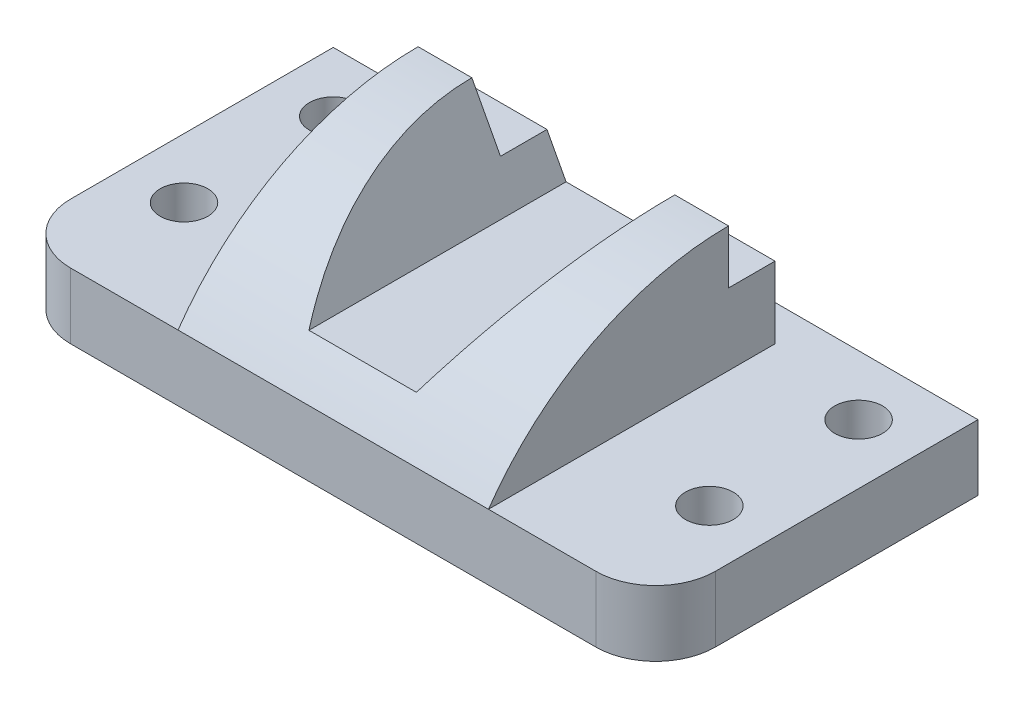
ISO-10303-21;
HEADER;
FILE_DESCRIPTION(('STEP AP214'),'2;1');
FILE_NAME('part.step','',(''),(''),'','','');
FILE_SCHEMA(('AUTOMOTIVE_DESIGN { 1 0 10303 214 1 1 1 1 }'));
ENDSEC;
DATA;
#1=APPLICATION_CONTEXT('core data for automotive mechanical design processes');
#2=APPLICATION_PROTOCOL_DEFINITION('international standard','automotive_design',2000,#1);
#3=PRODUCT_CONTEXT('',#1,'mechanical');
#4=PRODUCT('Part','Part','',(#3));
#5=PRODUCT_RELATED_PRODUCT_CATEGORY('part','',(#4));
#6=PRODUCT_DEFINITION_FORMATION('','',#4);
#7=PRODUCT_DEFINITION_CONTEXT('part definition',#1,'design');
#8=PRODUCT_DEFINITION('design','',#6,#7);
#9=PRODUCT_DEFINITION_SHAPE('','',#8);
#10=(LENGTH_UNIT() NAMED_UNIT(*) SI_UNIT(.MILLI.,.METRE.));
#11=(NAMED_UNIT(*) PLANE_ANGLE_UNIT() SI_UNIT($,.RADIAN.));
#12=(NAMED_UNIT(*) SI_UNIT($,.STERADIAN.) SOLID_ANGLE_UNIT());
#13=UNCERTAINTY_MEASURE_WITH_UNIT(LENGTH_MEASURE(1.E-05),#10,'distance_accuracy_value','');
#14=(GEOMETRIC_REPRESENTATION_CONTEXT(3) GLOBAL_UNCERTAINTY_ASSIGNED_CONTEXT((#13)) GLOBAL_UNIT_ASSIGNED_CONTEXT((#10,
#11,#12)) REPRESENTATION_CONTEXT('',''));
#15=CARTESIAN_POINT('',(0.,0.,0.));
#16=DIRECTION('',(0.,0.,1.));
#17=DIRECTION('',(1.,0.,0.));
#18=AXIS2_PLACEMENT_3D('',#15,#16,#17);
#19=CARTESIAN_POINT('',(26.,0.,27.));
#20=DIRECTION('',(-1.,0.,0.));
#21=DIRECTION('',(0.,0.,1.));
#22=AXIS2_PLACEMENT_3D('',#19,#20,#21);
#23=PLANE('',#22);
#24=DIRECTION('',(0.,-1.,0.));
#25=VECTOR('',#24,1.);
#26=CARTESIAN_POINT('',(26.,0.,-21.));
#27=LINE('',#26,#25);
#28=CARTESIAN_POINT('',(26.,23.,-21.));
#29=VERTEX_POINT('',#28);
#30=CARTESIAN_POINT('',(26.,10.9999999999999,-21.));
#31=VERTEX_POINT('',#30);
#32=EDGE_CURVE('E405',#29,#31,#27,.T.);
#33=ORIENTED_EDGE('',*,*,#32,.F.);
#34=DIRECTION('',(0.,0.,-1.));
#35=VECTOR('',#34,1.);
#36=CARTESIAN_POINT('',(26.,23.,27.));
#37=LINE('',#36,#35);
#38=CARTESIAN_POINT('',(26.,23.,-13.2119385257662));
#39=VERTEX_POINT('',#38);
#40=EDGE_CURVE('E391',#39,#29,#37,.T.);
#41=ORIENTED_EDGE('',*,*,#40,.F.);
#42=DIRECTION('',(0.,-1.,0.));
#43=VECTOR('',#42,1.);
#44=CARTESIAN_POINT('',(26.,0.,-13.2119385257662));
#45=LINE('',#44,#43);
#46=CARTESIAN_POINT('',(26.,32.,-13.2119385257662));
#47=VERTEX_POINT('',#46);
#48=EDGE_CURVE('E384',#47,#39,#45,.T.);
#49=ORIENTED_EDGE('',*,*,#48,.F.);
#50=CARTESIAN_POINT('',(26.,-17.,-13.2119385257662));
#51=DIRECTION('',(-1.,0.,0.));
#52=DIRECTION('',(0.,0.,1.));
#53=AXIS2_PLACEMENT_3D('',#50,#51,#52);
#54=CIRCLE('',#53,49.);
#55=CARTESIAN_POINT('',(26.,10.9999999999999,27.));
#56=VERTEX_POINT('',#55);
#57=EDGE_CURVE('E192',#56,#47,#54,.T.);
#58=ORIENTED_EDGE('',*,*,#57,.F.);
#59=DIRECTION('',(0.,0.,-1.));
#60=VECTOR('',#59,1.);
#61=CARTESIAN_POINT('',(26.,11.,27.));
#62=LINE('',#61,#60);
#63=EDGE_CURVE('E231',#56,#31,#62,.T.);
#64=ORIENTED_EDGE('',*,*,#63,.T.);
#65=EDGE_LOOP('',(#33,#41,#49,#58,#64));
#66=FACE_BOUND('',#65,.T.);
#67=ADVANCED_FACE('F41',(#66),#23,.F.);
#68=CARTESIAN_POINT('',(-0.0519031141868566,0.0276816608996569,27.));
#69=DIRECTION('',(0.88235294117647,-0.470588235294118,0.));
#70=DIRECTION('',(0.470588235294118,0.882352941176471,0.));
#71=AXIS2_PLACEMENT_3D('',#68,#69,#70);
#72=PLANE('',#71);
#73=DIRECTION('',(0.470588235294118,0.882352941176471,0.));
#74=VECTOR('',#73,1.);
#75=CARTESIAN_POINT('',(-0.0519031141868509,0.0276816608996677,-21.));
#76=LINE('',#75,#74);
#77=CARTESIAN_POINT('',(9.,17.,-21.));
#78=VERTEX_POINT('',#77);
#79=CARTESIAN_POINT('',(12.2,22.9999999999999,-21.));
#80=VERTEX_POINT('',#79);
#81=EDGE_CURVE('E399',#78,#80,#76,.T.);
#82=ORIENTED_EDGE('',*,*,#81,.F.);
#83=DIRECTION('',(0.,0.,-1.));
#84=VECTOR('',#83,1.);
#85=CARTESIAN_POINT('',(9.,17.,27.));
#86=LINE('',#85,#84);
#87=CARTESIAN_POINT('',(8.99999999999999,17.0000000000003,22.0726190029881));
#88=VERTEX_POINT('',#87);
#89=EDGE_CURVE('E230',#88,#78,#86,.T.);
#90=ORIENTED_EDGE('',*,*,#89,.F.);
#91=CARTESIAN_POINT('',(-9.13333333333344,-17.0000000000002,-13.2119385257662));
#92=DIRECTION('',(0.88235294117647,-0.470588235294118,0.));
#93=DIRECTION('',(0.470588235294118,0.882352941176471,0.));
#94=AXIS2_PLACEMENT_3D('',#91,#92,#93);
#95=ELLIPSE('',#94,55.5333333333335,49.);
#96=CARTESIAN_POINT('',(17.,32.,-13.2119385257662));
#97=VERTEX_POINT('',#96);
#98=EDGE_CURVE('E195',#97,#88,#95,.T.);
#99=ORIENTED_EDGE('',*,*,#98,.F.);
#100=DIRECTION('',(0.470588235294118,0.882352941176471,0.));
#101=VECTOR('',#100,1.);
#102=CARTESIAN_POINT('',(-0.0519031141868566,0.0276816608996569,-13.2119385257662));
#103=LINE('',#102,#101);
#104=CARTESIAN_POINT('',(12.1999999999999,22.9999999999999,-13.2119385257662));
#105=VERTEX_POINT('',#104);
#106=EDGE_CURVE('E382',#105,#97,#103,.T.);
#107=ORIENTED_EDGE('',*,*,#106,.F.);
#108=DIRECTION('',(0.,0.,1.));
#109=VECTOR('',#108,1.);
#110=CARTESIAN_POINT('',(12.2,22.9999999999999,27.));
#111=LINE('',#110,#109);
#112=EDGE_CURVE('E388',#80,#105,#111,.T.);
#113=ORIENTED_EDGE('',*,*,#112,.F.);
#114=EDGE_LOOP('',(#82,#90,#99,#107,#113));
#115=FACE_BOUND('',#114,.T.);
#116=ADVANCED_FACE('F278',(#115),#72,.F.);
#117=CARTESIAN_POINT('',(0.,17.,27.));
#118=DIRECTION('',(0.,1.,0.));
#119=DIRECTION('',(0.,0.,1.));
#120=AXIS2_PLACEMENT_3D('',#117,#118,#119);
#121=PLANE('',#120);
#122=ORIENTED_EDGE('',*,*,#89,.T.);
#123=DIRECTION('',(-1.,0.,0.));
#124=VECTOR('',#123,1.);
#125=CARTESIAN_POINT('',(0.,17.,-21.));
#126=LINE('',#125,#124);
#127=CARTESIAN_POINT('',(-9.,17.,-21.));
#128=VERTEX_POINT('',#127);
#129=EDGE_CURVE('E400',#78,#128,#126,.T.);
#130=ORIENTED_EDGE('',*,*,#129,.T.);
#131=DIRECTION('',(0.,0.,-1.));
#132=VECTOR('',#131,1.);
#133=CARTESIAN_POINT('',(-9.,17.,27.));
#134=LINE('',#133,#132);
#135=CARTESIAN_POINT('',(-9.,17.,22.0726190029884));
#136=VERTEX_POINT('',#135);
#137=EDGE_CURVE('E223',#136,#128,#134,.T.);
#138=ORIENTED_EDGE('',*,*,#137,.F.);
#139=DIRECTION('',(1.,0.,0.));
#140=VECTOR('',#139,1.);
#141=CARTESIAN_POINT('',(-54.,17.,22.0726190029881));
#142=LINE('',#141,#140);
#143=EDGE_CURVE('E189',#136,#88,#142,.T.);
#144=ORIENTED_EDGE('',*,*,#143,.T.);
#145=EDGE_LOOP('',(#122,#130,#138,#144));
#146=FACE_BOUND('',#145,.T.);
#147=ADVANCED_FACE('F286',(#146),#121,.T.);
#148=CARTESIAN_POINT('',(0.0519031141868566,0.0276816608996569,27.));
#149=DIRECTION('',(0.88235294117647,0.470588235294118,0.));
#150=DIRECTION('',(-0.470588235294118,0.882352941176471,0.));
#151=AXIS2_PLACEMENT_3D('',#148,#149,#150);
#152=PLANE('',#151);
#153=ORIENTED_EDGE('',*,*,#137,.T.);
#154=DIRECTION('',(-0.470588235294118,0.882352941176471,0.));
#155=VECTOR('',#154,1.);
#156=CARTESIAN_POINT('',(0.0519031141868509,0.0276816608996677,-21.));
#157=LINE('',#156,#155);
#158=CARTESIAN_POINT('',(-12.1999999999999,22.9999999999998,-21.));
#159=VERTEX_POINT('',#158);
#160=EDGE_CURVE('E393',#128,#159,#157,.T.);
#161=ORIENTED_EDGE('',*,*,#160,.T.);
#162=DIRECTION('',(0.,0.,1.));
#163=VECTOR('',#162,1.);
#164=CARTESIAN_POINT('',(-12.1999999999999,22.9999999999998,27.));
#165=LINE('',#164,#163);
#166=CARTESIAN_POINT('',(-12.1999999999999,22.9999999999998,-13.2119385257662));
#167=VERTEX_POINT('',#166);
#168=EDGE_CURVE('E390',#159,#167,#165,.T.);
#169=ORIENTED_EDGE('',*,*,#168,.T.);
#170=DIRECTION('',(-0.470588235294118,0.882352941176471,0.));
#171=VECTOR('',#170,1.);
#172=CARTESIAN_POINT('',(0.0519031141868566,0.0276816608996569,-13.2119385257662));
#173=LINE('',#172,#171);
#174=CARTESIAN_POINT('',(-17.,31.9999999999998,-13.2119385257662));
#175=VERTEX_POINT('',#174);
#176=EDGE_CURVE('E167',#167,#175,#173,.T.);
#177=ORIENTED_EDGE('',*,*,#176,.T.);
#178=CARTESIAN_POINT('',(9.13333333333338,-17.0000000000001,-13.2119385257662));
#179=DIRECTION('',(0.88235294117647,0.470588235294118,0.));
#180=DIRECTION('',(0.470588235294118,-0.882352941176471,0.));
#181=AXIS2_PLACEMENT_3D('',#178,#179,#180);
#182=ELLIPSE('',#181,55.5333333333332,49.);
#183=EDGE_CURVE('E180',#175,#136,#182,.T.);
#184=ORIENTED_EDGE('',*,*,#183,.T.);
#185=EDGE_LOOP('',(#153,#161,#169,#177,#184));
#186=FACE_BOUND('',#185,.T.);
#187=ADVANCED_FACE('F291',(#186),#152,.T.);
#188=CARTESIAN_POINT('',(-26.,0.,27.));
#189=DIRECTION('',(-1.,0.,0.));
#190=DIRECTION('',(0.,0.,1.));
#191=AXIS2_PLACEMENT_3D('',#188,#189,#190);
#192=PLANE('',#191);
#193=DIRECTION('',(0.,0.,-1.));
#194=VECTOR('',#193,1.);
#195=CARTESIAN_POINT('',(-26.,22.9999999999998,27.));
#196=LINE('',#195,#194);
#197=CARTESIAN_POINT('',(-26.,22.9999999999996,-13.2119385257662));
#198=VERTEX_POINT('',#197);
#199=CARTESIAN_POINT('',(-26.,22.9999999999998,-21.));
#200=VERTEX_POINT('',#199);
#201=EDGE_CURVE('E234',#198,#200,#196,.T.);
#202=ORIENTED_EDGE('',*,*,#201,.T.);
#203=DIRECTION('',(0.,-1.,0.));
#204=VECTOR('',#203,1.);
#205=CARTESIAN_POINT('',(-26.,0.,-21.));
#206=LINE('',#205,#204);
#207=CARTESIAN_POINT('',(-26.,10.9999999999996,-21.));
#208=VERTEX_POINT('',#207);
#209=EDGE_CURVE('E240',#200,#208,#206,.T.);
#210=ORIENTED_EDGE('',*,*,#209,.T.);
#211=DIRECTION('',(0.,0.,-1.));
#212=VECTOR('',#211,1.);
#213=CARTESIAN_POINT('',(-26.,11.,27.));
#214=LINE('',#213,#212);
#215=CARTESIAN_POINT('',(-26.,10.9999999999996,27.));
#216=VERTEX_POINT('',#215);
#217=EDGE_CURVE('E184',#216,#208,#214,.T.);
#218=ORIENTED_EDGE('',*,*,#217,.F.);
#219=CARTESIAN_POINT('',(-26.,-17.0000000000003,-13.2119385257662));
#220=DIRECTION('',(-1.,0.,0.));
#221=DIRECTION('',(0.,0.,1.));
#222=AXIS2_PLACEMENT_3D('',#219,#220,#221);
#223=CIRCLE('',#222,49.);
#224=CARTESIAN_POINT('',(-26.,31.9999999999997,-13.2119385257662));
#225=VERTEX_POINT('',#224);
#226=EDGE_CURVE('E173',#216,#225,#223,.T.);
#227=ORIENTED_EDGE('',*,*,#226,.T.);
#228=DIRECTION('',(0.,-1.,0.));
#229=VECTOR('',#228,1.);
#230=CARTESIAN_POINT('',(-26.,0.,-13.2119385257662));
#231=LINE('',#230,#229);
#232=EDGE_CURVE('E154',#225,#198,#231,.T.);
#233=ORIENTED_EDGE('',*,*,#232,.T.);
#234=EDGE_LOOP('',(#202,#210,#218,#227,#233));
#235=FACE_BOUND('',#234,.T.);
#236=ADVANCED_FACE('F182',(#235),#192,.T.);
#237=CARTESIAN_POINT('',(0.,11.,27.));
#238=DIRECTION('',(0.,1.,0.));
#239=DIRECTION('',(0.,0.,1.));
#240=AXIS2_PLACEMENT_3D('',#237,#238,#239);
#241=PLANE('',#240);
#242=CARTESIAN_POINT('',(44.,11.,-17.));
#243=DIRECTION('',(0.,1.,0.));
#244=DIRECTION('',(0.,0.,-1.));
#245=AXIS2_PLACEMENT_3D('',#242,#243,#244);
#246=CIRCLE('',#245,4.00000000000001);
#247=CARTESIAN_POINT('',(44.,11.,-21.));
#248=VERTEX_POINT('',#247);
#249=EDGE_CURVE('E364',#248,#248,#246,.T.);
#250=ORIENTED_EDGE('',*,*,#249,.F.);
#251=EDGE_LOOP('',(#250));
#252=FACE_BOUND('',#251,.T.);
#253=CARTESIAN_POINT('',(44.,11.,8.));
#254=DIRECTION('',(0.,1.,0.));
#255=DIRECTION('',(0.,0.,-1.));
#256=AXIS2_PLACEMENT_3D('',#253,#254,#255);
#257=CIRCLE('',#256,4.00000000000001);
#258=CARTESIAN_POINT('',(44.,11.,4.));
#259=VERTEX_POINT('',#258);
#260=EDGE_CURVE('E360',#259,#259,#257,.T.);
#261=ORIENTED_EDGE('',*,*,#260,.F.);
#262=EDGE_LOOP('',(#261));
#263=FACE_BOUND('',#262,.T.);
#264=CARTESIAN_POINT('',(-44.,11.,8.));
#265=DIRECTION('',(0.,1.,0.));
#266=DIRECTION('',(0.,0.,1.));
#267=AXIS2_PLACEMENT_3D('',#264,#265,#266);
#268=CIRCLE('',#267,4.00000000000001);
#269=CARTESIAN_POINT('',(-44.,11.,12.));
#270=VERTEX_POINT('',#269);
#271=EDGE_CURVE('E348',#270,#270,#268,.T.);
#272=ORIENTED_EDGE('',*,*,#271,.F.);
#273=EDGE_LOOP('',(#272));
#274=FACE_BOUND('',#273,.T.);
#275=CARTESIAN_POINT('',(-44.,11.,-17.));
#276=DIRECTION('',(0.,1.,0.));
#277=DIRECTION('',(0.,0.,1.));
#278=AXIS2_PLACEMENT_3D('',#275,#276,#277);
#279=CIRCLE('',#278,4.00000000000001);
#280=CARTESIAN_POINT('',(-44.,11.,-13.));
#281=VERTEX_POINT('',#280);
#282=EDGE_CURVE('E351',#281,#281,#279,.T.);
#283=ORIENTED_EDGE('',*,*,#282,.F.);
#284=EDGE_LOOP('',(#283));
#285=FACE_BOUND('',#284,.T.);
#286=DIRECTION('',(1.,0.,0.));
#287=VECTOR('',#286,1.);
#288=CARTESIAN_POINT('',(0.,11.,27.));
#289=LINE('',#288,#287);
#290=CARTESIAN_POINT('',(44.,11.,27.));
#291=VERTEX_POINT('',#290);
#292=EDGE_CURVE('E197',#56,#291,#289,.T.);
#293=ORIENTED_EDGE('',*,*,#292,.T.);
#294=CARTESIAN_POINT('',(44.,11.,17.));
#295=DIRECTION('',(0.,1.,0.));
#296=DIRECTION('',(0.,0.,1.));
#297=AXIS2_PLACEMENT_3D('',#294,#295,#296);
#298=CIRCLE('',#297,10.);
#299=CARTESIAN_POINT('',(54.,11.,17.));
#300=VERTEX_POINT('',#299);
#301=EDGE_CURVE('E246',#291,#300,#298,.T.);
#302=ORIENTED_EDGE('',*,*,#301,.T.);
#303=DIRECTION('',(0.,0.,-1.));
#304=VECTOR('',#303,1.);
#305=CARTESIAN_POINT('',(54.,11.,27.));
#306=LINE('',#305,#304);
#307=CARTESIAN_POINT('',(54.,11.,-27.));
#308=VERTEX_POINT('',#307);
#309=EDGE_CURVE('E206',#300,#308,#306,.T.);
#310=ORIENTED_EDGE('',*,*,#309,.T.);
#311=DIRECTION('',(1.,0.,0.));
#312=VECTOR('',#311,1.);
#313=CARTESIAN_POINT('',(0.,11.,-27.));
#314=LINE('',#313,#312);
#315=CARTESIAN_POINT('',(-54.,11.,-27.));
#316=VERTEX_POINT('',#315);
#317=EDGE_CURVE('E198',#316,#308,#314,.T.);
#318=ORIENTED_EDGE('',*,*,#317,.F.);
#319=DIRECTION('',(0.,0.,-1.));
#320=VECTOR('',#319,1.);
#321=CARTESIAN_POINT('',(-54.,11.,27.));
#322=LINE('',#321,#320);
#323=CARTESIAN_POINT('',(-54.,11.,17.));
#324=VERTEX_POINT('',#323);
#325=EDGE_CURVE('E225',#324,#316,#322,.T.);
#326=ORIENTED_EDGE('',*,*,#325,.F.);
#327=CARTESIAN_POINT('',(-44.,11.,17.));
#328=DIRECTION('',(0.,1.,0.));
#329=DIRECTION('',(0.,0.,1.));
#330=AXIS2_PLACEMENT_3D('',#327,#328,#329);
#331=CIRCLE('',#330,10.);
#332=CARTESIAN_POINT('',(-44.,11.,27.));
#333=VERTEX_POINT('',#332);
#334=EDGE_CURVE('E243',#324,#333,#331,.T.);
#335=ORIENTED_EDGE('',*,*,#334,.T.);
#336=DIRECTION('',(1.,0.,0.));
#337=VECTOR('',#336,1.);
#338=CARTESIAN_POINT('',(0.,11.,27.));
#339=LINE('',#338,#337);
#340=EDGE_CURVE('E199',#333,#216,#339,.T.);
#341=ORIENTED_EDGE('',*,*,#340,.T.);
#342=ORIENTED_EDGE('',*,*,#217,.T.);
#343=DIRECTION('',(1.,0.,0.));
#344=VECTOR('',#343,1.);
#345=CARTESIAN_POINT('',(-54.0000000000001,10.9999999999995,-21.));
#346=LINE('',#345,#344);
#347=EDGE_CURVE('E170',#208,#31,#346,.T.);
#348=ORIENTED_EDGE('',*,*,#347,.T.);
#349=ORIENTED_EDGE('',*,*,#63,.F.);
#350=EDGE_LOOP('',(#293,#302,#310,#318,#326,#335,#341,#342,#348,#349));
#351=FACE_BOUND('',#350,.T.);
#352=ADVANCED_FACE('F257',(#252,#263,#274,#285,#351),#241,.T.);
#353=CARTESIAN_POINT('',(-54.,2.72509287862538E-13,27.));
#354=DIRECTION('',(-1.,0.,0.));
#355=DIRECTION('',(0.,-1.,0.));
#356=AXIS2_PLACEMENT_3D('',#353,#354,#355);
#357=PLANE('',#356);
#358=DIRECTION('',(0.,0.,-1.));
#359=VECTOR('',#358,1.);
#360=CARTESIAN_POINT('',(-54.,0.,27.));
#361=LINE('',#360,#359);
#362=CARTESIAN_POINT('',(-54.,0.,17.));
#363=VERTEX_POINT('',#362);
#364=CARTESIAN_POINT('',(-54.,0.,-27.));
#365=VERTEX_POINT('',#364);
#366=EDGE_CURVE('E219',#363,#365,#361,.T.);
#367=ORIENTED_EDGE('',*,*,#366,.F.);
#368=DIRECTION('',(0.,1.,0.));
#369=VECTOR('',#368,1.);
#370=CARTESIAN_POINT('',(-54.,2.72509287862538E-13,17.));
#371=LINE('',#370,#369);
#372=EDGE_CURVE('E11',#363,#324,#371,.T.);
#373=ORIENTED_EDGE('',*,*,#372,.T.);
#374=ORIENTED_EDGE('',*,*,#325,.T.);
#375=DIRECTION('',(0.,1.,0.));
#376=VECTOR('',#375,1.);
#377=CARTESIAN_POINT('',(-54.,2.72509287862538E-13,-27.));
#378=LINE('',#377,#376);
#379=EDGE_CURVE('E207',#365,#316,#378,.T.);
#380=ORIENTED_EDGE('',*,*,#379,.F.);
#381=EDGE_LOOP('',(#367,#373,#374,#380));
#382=FACE_BOUND('',#381,.T.);
#383=ADVANCED_FACE('F271',(#382),#357,.T.);
#384=CARTESIAN_POINT('',(0.,0.,27.));
#385=DIRECTION('',(0.,1.,0.));
#386=DIRECTION('',(-1.,0.,0.));
#387=AXIS2_PLACEMENT_3D('',#384,#385,#386);
#388=PLANE('',#387);
#389=CARTESIAN_POINT('',(44.,0.,-17.));
#390=DIRECTION('',(0.,1.,0.));
#391=DIRECTION('',(0.,0.,-1.));
#392=AXIS2_PLACEMENT_3D('',#389,#390,#391);
#393=CIRCLE('',#392,4.00000000000001);
#394=CARTESIAN_POINT('',(44.,0.,-21.));
#395=VERTEX_POINT('',#394);
#396=EDGE_CURVE('E366',#395,#395,#393,.T.);
#397=ORIENTED_EDGE('',*,*,#396,.T.);
#398=EDGE_LOOP('',(#397));
#399=FACE_BOUND('',#398,.T.);
#400=CARTESIAN_POINT('',(44.,0.,8.));
#401=DIRECTION('',(0.,1.,0.));
#402=DIRECTION('',(0.,0.,-1.));
#403=AXIS2_PLACEMENT_3D('',#400,#401,#402);
#404=CIRCLE('',#403,4.00000000000001);
#405=CARTESIAN_POINT('',(44.,0.,4.));
#406=VERTEX_POINT('',#405);
#407=EDGE_CURVE('E362',#406,#406,#404,.T.);
#408=ORIENTED_EDGE('',*,*,#407,.T.);
#409=EDGE_LOOP('',(#408));
#410=FACE_BOUND('',#409,.T.);
#411=CARTESIAN_POINT('',(-44.,0.,8.));
#412=DIRECTION('',(0.,1.,0.));
#413=DIRECTION('',(0.,0.,1.));
#414=AXIS2_PLACEMENT_3D('',#411,#412,#413);
#415=CIRCLE('',#414,4.00000000000001);
#416=CARTESIAN_POINT('',(-44.,0.,12.));
#417=VERTEX_POINT('',#416);
#418=EDGE_CURVE('E350',#417,#417,#415,.T.);
#419=ORIENTED_EDGE('',*,*,#418,.T.);
#420=EDGE_LOOP('',(#419));
#421=FACE_BOUND('',#420,.T.);
#422=CARTESIAN_POINT('',(-44.,0.,-17.));
#423=DIRECTION('',(0.,1.,0.));
#424=DIRECTION('',(0.,0.,1.));
#425=AXIS2_PLACEMENT_3D('',#422,#423,#424);
#426=CIRCLE('',#425,4.00000000000001);
#427=CARTESIAN_POINT('',(-44.,0.,-13.));
#428=VERTEX_POINT('',#427);
#429=EDGE_CURVE('E352',#428,#428,#426,.T.);
#430=ORIENTED_EDGE('',*,*,#429,.T.);
#431=EDGE_LOOP('',(#430));
#432=FACE_BOUND('',#431,.T.);
#433=DIRECTION('',(0.,0.,-1.));
#434=VECTOR('',#433,1.);
#435=CARTESIAN_POINT('',(54.,0.,27.));
#436=LINE('',#435,#434);
#437=CARTESIAN_POINT('',(54.,0.,17.));
#438=VERTEX_POINT('',#437);
#439=CARTESIAN_POINT('',(54.,0.,-27.));
#440=VERTEX_POINT('',#439);
#441=EDGE_CURVE('E217',#438,#440,#436,.T.);
#442=ORIENTED_EDGE('',*,*,#441,.F.);
#443=CARTESIAN_POINT('',(44.,0.,17.));
#444=DIRECTION('',(0.,1.,0.));
#445=DIRECTION('',(-1.,0.,0.));
#446=AXIS2_PLACEMENT_3D('',#443,#444,#445);
#447=CIRCLE('',#446,10.);
#448=CARTESIAN_POINT('',(44.,0.,27.));
#449=VERTEX_POINT('',#448);
#450=EDGE_CURVE('E47',#438,#449,#447,.F.);
#451=ORIENTED_EDGE('',*,*,#450,.T.);
#452=DIRECTION('',(1.,0.,0.));
#453=VECTOR('',#452,1.);
#454=CARTESIAN_POINT('',(0.,0.,27.));
#455=LINE('',#454,#453);
#456=CARTESIAN_POINT('',(-44.,0.,27.));
#457=VERTEX_POINT('',#456);
#458=EDGE_CURVE('E201',#457,#449,#455,.T.);
#459=ORIENTED_EDGE('',*,*,#458,.F.);
#460=CARTESIAN_POINT('',(-44.,0.,17.));
#461=DIRECTION('',(0.,1.,0.));
#462=DIRECTION('',(-1.,0.,0.));
#463=AXIS2_PLACEMENT_3D('',#460,#461,#462);
#464=CIRCLE('',#463,10.);
#465=EDGE_CURVE('E57',#457,#363,#464,.F.);
#466=ORIENTED_EDGE('',*,*,#465,.T.);
#467=ORIENTED_EDGE('',*,*,#366,.T.);
#468=DIRECTION('',(1.,0.,0.));
#469=VECTOR('',#468,1.);
#470=CARTESIAN_POINT('',(0.,0.,-27.));
#471=LINE('',#470,#469);
#472=EDGE_CURVE('E215',#365,#440,#471,.T.);
#473=ORIENTED_EDGE('',*,*,#472,.T.);
#474=EDGE_LOOP('',(#442,#451,#459,#466,#467,#473));
#475=FACE_BOUND('',#474,.T.);
#476=ADVANCED_FACE('F249',(#399,#410,#421,#432,#475),#388,.F.);
#477=CARTESIAN_POINT('',(54.,2.72509287862539E-13,27.));
#478=DIRECTION('',(-1.,0.,0.));
#479=DIRECTION('',(0.,-1.,0.));
#480=AXIS2_PLACEMENT_3D('',#477,#478,#479);
#481=PLANE('',#480);
#482=ORIENTED_EDGE('',*,*,#309,.F.);
#483=DIRECTION('',(0.,1.,0.));
#484=VECTOR('',#483,1.);
#485=CARTESIAN_POINT('',(54.,0.,17.));
#486=LINE('',#485,#484);
#487=EDGE_CURVE('E63',#300,#438,#486,.F.);
#488=ORIENTED_EDGE('',*,*,#487,.T.);
#489=ORIENTED_EDGE('',*,*,#441,.T.);
#490=DIRECTION('',(0.,1.,0.));
#491=VECTOR('',#490,1.);
#492=CARTESIAN_POINT('',(54.,2.72509287862539E-13,-27.));
#493=LINE('',#492,#491);
#494=EDGE_CURVE('E203',#440,#308,#493,.T.);
#495=ORIENTED_EDGE('',*,*,#494,.T.);
#496=EDGE_LOOP('',(#482,#488,#489,#495));
#497=FACE_BOUND('',#496,.T.);
#498=ADVANCED_FACE('F263',(#497),#481,.F.);
#499=CARTESIAN_POINT('',(0.,0.,27.));
#500=DIRECTION('',(0.,0.,1.));
#501=DIRECTION('',(1.,0.,0.));
#502=AXIS2_PLACEMENT_3D('',#499,#500,#501);
#503=PLANE('',#502);
#504=ORIENTED_EDGE('',*,*,#458,.T.);
#505=DIRECTION('',(0.,1.,0.));
#506=VECTOR('',#505,1.);
#507=CARTESIAN_POINT('',(44.,11.,27.));
#508=LINE('',#507,#506);
#509=EDGE_CURVE('E244',#449,#291,#508,.T.);
#510=ORIENTED_EDGE('',*,*,#509,.T.);
#511=ORIENTED_EDGE('',*,*,#292,.F.);
#512=DIRECTION('',(1.,0.,0.));
#513=VECTOR('',#512,1.);
#514=CARTESIAN_POINT('',(-54.0000000000001,10.9999999999995,27.));
#515=LINE('',#514,#513);
#516=EDGE_CURVE('E232',#216,#56,#515,.T.);
#517=ORIENTED_EDGE('',*,*,#516,.F.);
#518=ORIENTED_EDGE('',*,*,#340,.F.);
#519=DIRECTION('',(0.,1.,0.));
#520=VECTOR('',#519,1.);
#521=CARTESIAN_POINT('',(-44.,2.22044604925031E-13,27.));
#522=LINE('',#521,#520);
#523=EDGE_CURVE('E239',#333,#457,#522,.F.);
#524=ORIENTED_EDGE('',*,*,#523,.T.);
#525=EDGE_LOOP('',(#504,#510,#511,#517,#518,#524));
#526=FACE_BOUND('',#525,.T.);
#527=ADVANCED_FACE('F255',(#526),#503,.T.);
#528=CARTESIAN_POINT('',(0.,0.,-27.));
#529=DIRECTION('',(0.,0.,1.));
#530=DIRECTION('',(1.,0.,0.));
#531=AXIS2_PLACEMENT_3D('',#528,#529,#530);
#532=PLANE('',#531);
#533=ORIENTED_EDGE('',*,*,#317,.T.);
#534=ORIENTED_EDGE('',*,*,#494,.F.);
#535=ORIENTED_EDGE('',*,*,#472,.F.);
#536=ORIENTED_EDGE('',*,*,#379,.T.);
#537=EDGE_LOOP('',(#533,#534,#535,#536));
#538=FACE_BOUND('',#537,.T.);
#539=ADVANCED_FACE('F270',(#538),#532,.F.);
#540=CARTESIAN_POINT('',(-54.,-17.0000000000004,-13.2119385257662));
#541=DIRECTION('',(1.,0.,0.));
#542=DIRECTION('',(0.,1.,0.));
#543=AXIS2_PLACEMENT_3D('',#540,#541,#542);
#544=CYLINDRICAL_SURFACE('',#543,49.);
#545=ORIENTED_EDGE('',*,*,#57,.T.);
#546=DIRECTION('',(1.,0.,0.));
#547=VECTOR('',#546,1.);
#548=CARTESIAN_POINT('',(-54.0000000000002,31.9999999999996,-13.2119385257662));
#549=LINE('',#548,#547);
#550=EDGE_CURVE('E178',#97,#47,#549,.T.);
#551=ORIENTED_EDGE('',*,*,#550,.F.);
#552=ORIENTED_EDGE('',*,*,#98,.T.);
#553=ORIENTED_EDGE('',*,*,#143,.F.);
#554=ORIENTED_EDGE('',*,*,#183,.F.);
#555=EDGE_CURVE('E158',#225,#175,#549,.T.);
#556=ORIENTED_EDGE('',*,*,#555,.F.);
#557=ORIENTED_EDGE('',*,*,#226,.F.);
#558=ORIENTED_EDGE('',*,*,#516,.T.);
#559=EDGE_LOOP('',(#545,#551,#552,#553,#554,#556,#557,#558));
#560=FACE_BOUND('',#559,.T.);
#561=ADVANCED_FACE('F175',(#560),#544,.T.);
#562=CARTESIAN_POINT('',(-54.,-2.63457862144165E-13,-21.));
#563=DIRECTION('',(0.,0.,-1.));
#564=DIRECTION('',(0.,1.,0.));
#565=AXIS2_PLACEMENT_3D('',#562,#563,#564);
#566=PLANE('',#565);
#567=ORIENTED_EDGE('',*,*,#32,.T.);
#568=ORIENTED_EDGE('',*,*,#347,.F.);
#569=ORIENTED_EDGE('',*,*,#209,.F.);
#570=DIRECTION('',(1.,0.,0.));
#571=VECTOR('',#570,1.);
#572=CARTESIAN_POINT('',(-54.0000000000002,22.9999999999996,-21.));
#573=LINE('',#572,#571);
#574=EDGE_CURVE('E376',#200,#159,#573,.T.);
#575=ORIENTED_EDGE('',*,*,#574,.T.);
#576=ORIENTED_EDGE('',*,*,#160,.F.);
#577=ORIENTED_EDGE('',*,*,#129,.F.);
#578=ORIENTED_EDGE('',*,*,#81,.T.);
#579=EDGE_CURVE('E380',#80,#29,#573,.T.);
#580=ORIENTED_EDGE('',*,*,#579,.T.);
#581=EDGE_LOOP('',(#567,#568,#569,#575,#576,#577,#578,#580));
#582=FACE_BOUND('',#581,.T.);
#583=ADVANCED_FACE('F316',(#582),#566,.T.);
#584=CARTESIAN_POINT('',(-54.0000000000002,22.9999999999996,0.));
#585=DIRECTION('',(0.,1.,0.));
#586=DIRECTION('',(-1.,0.,0.));
#587=AXIS2_PLACEMENT_3D('',#584,#585,#586);
#588=PLANE('',#587);
#589=ORIENTED_EDGE('',*,*,#40,.T.);
#590=ORIENTED_EDGE('',*,*,#579,.F.);
#591=ORIENTED_EDGE('',*,*,#112,.T.);
#592=DIRECTION('',(1.,0.,0.));
#593=VECTOR('',#592,1.);
#594=CARTESIAN_POINT('',(-54.0000000000002,22.9999999999996,-13.2119385257662));
#595=LINE('',#594,#593);
#596=EDGE_CURVE('E375',#105,#39,#595,.T.);
#597=ORIENTED_EDGE('',*,*,#596,.T.);
#598=EDGE_LOOP('',(#589,#590,#591,#597));
#599=FACE_BOUND('',#598,.T.);
#600=ADVANCED_FACE('F324',(#599),#588,.T.);
#601=CARTESIAN_POINT('',(-54.,-2.69529394310084E-13,-13.2119385257662));
#602=DIRECTION('',(0.,0.,-1.));
#603=DIRECTION('',(-1.,0.,0.));
#604=AXIS2_PLACEMENT_3D('',#601,#602,#603);
#605=PLANE('',#604);
#606=ORIENTED_EDGE('',*,*,#48,.T.);
#607=ORIENTED_EDGE('',*,*,#596,.F.);
#608=ORIENTED_EDGE('',*,*,#106,.T.);
#609=ORIENTED_EDGE('',*,*,#550,.T.);
#610=EDGE_LOOP('',(#606,#607,#608,#609));
#611=FACE_BOUND('',#610,.T.);
#612=ADVANCED_FACE('F321',(#611),#605,.T.);
#613=ORIENTED_EDGE('',*,*,#574,.F.);
#614=ORIENTED_EDGE('',*,*,#201,.F.);
#615=EDGE_CURVE('E161',#198,#167,#595,.T.);
#616=ORIENTED_EDGE('',*,*,#615,.T.);
#617=ORIENTED_EDGE('',*,*,#168,.F.);
#618=EDGE_LOOP('',(#613,#614,#616,#617));
#619=FACE_BOUND('',#618,.T.);
#620=ADVANCED_FACE('F319',(#619),#588,.T.);
#621=ORIENTED_EDGE('',*,*,#615,.F.);
#622=ORIENTED_EDGE('',*,*,#232,.F.);
#623=ORIENTED_EDGE('',*,*,#555,.T.);
#624=ORIENTED_EDGE('',*,*,#176,.F.);
#625=EDGE_LOOP('',(#621,#622,#623,#624));
#626=FACE_BOUND('',#625,.T.);
#627=ADVANCED_FACE('F160',(#626),#605,.T.);
#628=CARTESIAN_POINT('',(-44.,0.,-17.));
#629=DIRECTION('',(0.,1.,0.));
#630=DIRECTION('',(0.,0.,1.));
#631=AXIS2_PLACEMENT_3D('',#628,#629,#630);
#632=CYLINDRICAL_SURFACE('',#631,4.00000000000001);
#633=ORIENTED_EDGE('',*,*,#429,.F.);
#634=EDGE_LOOP('',(#633));
#635=FACE_BOUND('',#634,.T.);
#636=ORIENTED_EDGE('',*,*,#282,.T.);
#637=EDGE_LOOP('',(#636));
#638=FACE_BOUND('',#637,.T.);
#639=ADVANCED_FACE('F317',(#635,#638),#632,.F.);
#640=CARTESIAN_POINT('',(-44.,0.,8.));
#641=DIRECTION('',(0.,1.,0.));
#642=DIRECTION('',(0.,0.,1.));
#643=AXIS2_PLACEMENT_3D('',#640,#641,#642);
#644=CYLINDRICAL_SURFACE('',#643,4.00000000000001);
#645=ORIENTED_EDGE('',*,*,#418,.F.);
#646=EDGE_LOOP('',(#645));
#647=FACE_BOUND('',#646,.T.);
#648=ORIENTED_EDGE('',*,*,#271,.T.);
#649=EDGE_LOOP('',(#648));
#650=FACE_BOUND('',#649,.T.);
#651=ADVANCED_FACE('F332',(#647,#650),#644,.F.);
#652=CARTESIAN_POINT('',(44.,0.,8.));
#653=DIRECTION('',(0.,1.,0.));
#654=DIRECTION('',(0.,0.,1.));
#655=AXIS2_PLACEMENT_3D('',#652,#653,#654);
#656=CYLINDRICAL_SURFACE('',#655,4.00000000000001);
#657=ORIENTED_EDGE('',*,*,#407,.F.);
#658=EDGE_LOOP('',(#657));
#659=FACE_BOUND('',#658,.T.);
#660=ORIENTED_EDGE('',*,*,#260,.T.);
#661=EDGE_LOOP('',(#660));
#662=FACE_BOUND('',#661,.T.);
#663=ADVANCED_FACE('F333',(#659,#662),#656,.F.);
#664=CARTESIAN_POINT('',(44.,0.,-17.));
#665=DIRECTION('',(0.,1.,0.));
#666=DIRECTION('',(0.,0.,1.));
#667=AXIS2_PLACEMENT_3D('',#664,#665,#666);
#668=CYLINDRICAL_SURFACE('',#667,4.00000000000001);
#669=ORIENTED_EDGE('',*,*,#396,.F.);
#670=EDGE_LOOP('',(#669));
#671=FACE_BOUND('',#670,.T.);
#672=ORIENTED_EDGE('',*,*,#249,.T.);
#673=EDGE_LOOP('',(#672));
#674=FACE_BOUND('',#673,.T.);
#675=ADVANCED_FACE('F279',(#671,#674),#668,.F.);
#676=CARTESIAN_POINT('',(44.,2.22044604925032E-13,17.));
#677=DIRECTION('',(0.,-1.,0.));
#678=DIRECTION('',(1.,0.,0.));
#679=AXIS2_PLACEMENT_3D('',#676,#677,#678);
#680=CYLINDRICAL_SURFACE('',#679,10.);
#681=ORIENTED_EDGE('',*,*,#450,.F.);
#682=ORIENTED_EDGE('',*,*,#487,.F.);
#683=ORIENTED_EDGE('',*,*,#301,.F.);
#684=ORIENTED_EDGE('',*,*,#509,.F.);
#685=EDGE_LOOP('',(#681,#682,#683,#684));
#686=FACE_BOUND('',#685,.T.);
#687=ADVANCED_FACE('F256',(#686),#680,.T.);
#688=CARTESIAN_POINT('',(-44.,2.22044604925031E-13,17.));
#689=DIRECTION('',(0.,1.,0.));
#690=DIRECTION('',(-1.,0.,0.));
#691=AXIS2_PLACEMENT_3D('',#688,#689,#690);
#692=CYLINDRICAL_SURFACE('',#691,10.);
#693=ORIENTED_EDGE('',*,*,#465,.F.);
#694=ORIENTED_EDGE('',*,*,#523,.F.);
#695=ORIENTED_EDGE('',*,*,#334,.F.);
#696=ORIENTED_EDGE('',*,*,#372,.F.);
#697=EDGE_LOOP('',(#693,#694,#695,#696));
#698=FACE_BOUND('',#697,.T.);
#699=ADVANCED_FACE('F43',(#698),#692,.T.);
#700=CLOSED_SHELL('',(#67,#116,#147,#187,#236,#352,#383,#476,#498,#527,#539,#561,#583,#600,#612,
#620,#627,#639,#651,#663,#675,#687,#699));
#701=MANIFOLD_SOLID_BREP('B2',#700);
#702=ADVANCED_BREP_SHAPE_REPRESENTATION('',(#18,#701),#14);
#703=SHAPE_DEFINITION_REPRESENTATION(#9,#702);
ENDSEC;
END-ISO-10303-21;
